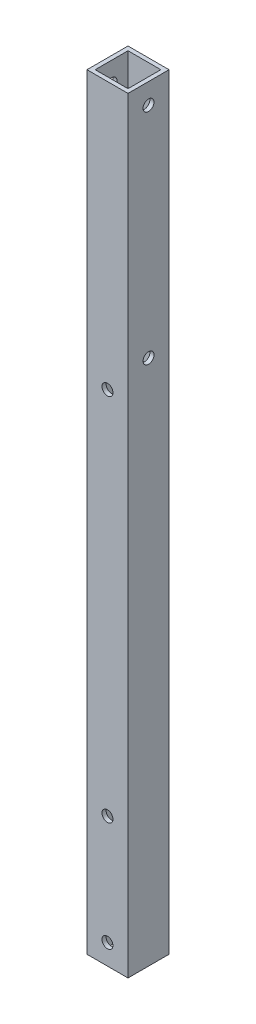
ISO-10303-21;
HEADER;
FILE_DESCRIPTION(('STEP AP214'),'2;1');
FILE_NAME('part.step','',(''),(''),'','','');
FILE_SCHEMA(('AUTOMOTIVE_DESIGN { 1 0 10303 214 1 1 1 1 }'));
ENDSEC;
DATA;
#1=APPLICATION_CONTEXT('core data for automotive mechanical design processes');
#2=APPLICATION_PROTOCOL_DEFINITION('international standard','automotive_design',2000,#1);
#3=PRODUCT_CONTEXT('',#1,'mechanical');
#4=PRODUCT('Part','Part','',(#3));
#5=PRODUCT_RELATED_PRODUCT_CATEGORY('part','',(#4));
#6=PRODUCT_DEFINITION_FORMATION('','',#4);
#7=PRODUCT_DEFINITION_CONTEXT('part definition',#1,'design');
#8=PRODUCT_DEFINITION('design','',#6,#7);
#9=PRODUCT_DEFINITION_SHAPE('','',#8);
#10=(LENGTH_UNIT() NAMED_UNIT(*) SI_UNIT(.MILLI.,.METRE.));
#11=(NAMED_UNIT(*) PLANE_ANGLE_UNIT() SI_UNIT($,.RADIAN.));
#12=(NAMED_UNIT(*) SI_UNIT($,.STERADIAN.) SOLID_ANGLE_UNIT());
#13=UNCERTAINTY_MEASURE_WITH_UNIT(LENGTH_MEASURE(1.E-05),#10,'distance_accuracy_value','');
#14=(GEOMETRIC_REPRESENTATION_CONTEXT(3) GLOBAL_UNCERTAINTY_ASSIGNED_CONTEXT((#13)) GLOBAL_UNIT_ASSIGNED_CONTEXT((#10,
#11,#12)) REPRESENTATION_CONTEXT('',''));
#15=CARTESIAN_POINT('',(0.,0.,0.));
#16=DIRECTION('',(0.,0.,1.));
#17=DIRECTION('',(1.,0.,0.));
#18=AXIS2_PLACEMENT_3D('',#15,#16,#17);
#19=CARTESIAN_POINT('',(0.,280.,0.));
#20=DIRECTION('',(0.,1.,0.));
#21=DIRECTION('',(0.,0.,1.));
#22=AXIS2_PLACEMENT_3D('',#19,#20,#21);
#23=PLANE('',#22);
#24=DIRECTION('',(0.,0.,-1.));
#25=VECTOR('',#24,1.);
#26=CARTESIAN_POINT('',(7.5,280.,7.5));
#27=LINE('',#26,#25);
#28=CARTESIAN_POINT('',(7.5,280.,7.5));
#29=VERTEX_POINT('',#28);
#30=CARTESIAN_POINT('',(7.5,280.,-7.5));
#31=VERTEX_POINT('',#30);
#32=EDGE_CURVE('E181',#29,#31,#27,.T.);
#33=ORIENTED_EDGE('',*,*,#32,.T.);
#34=DIRECTION('',(-1.,0.,0.));
#35=VECTOR('',#34,1.);
#36=CARTESIAN_POINT('',(-7.5,280.,-7.5));
#37=LINE('',#36,#35);
#38=CARTESIAN_POINT('',(-7.5,280.,-7.5));
#39=VERTEX_POINT('',#38);
#40=EDGE_CURVE('E185',#31,#39,#37,.T.);
#41=ORIENTED_EDGE('',*,*,#40,.T.);
#42=DIRECTION('',(0.,0.,1.));
#43=VECTOR('',#42,1.);
#44=CARTESIAN_POINT('',(-7.5,280.,7.5));
#45=LINE('',#44,#43);
#46=CARTESIAN_POINT('',(-7.5,280.,7.5));
#47=VERTEX_POINT('',#46);
#48=EDGE_CURVE('E189',#39,#47,#45,.T.);
#49=ORIENTED_EDGE('',*,*,#48,.T.);
#50=DIRECTION('',(1.,0.,0.));
#51=VECTOR('',#50,1.);
#52=CARTESIAN_POINT('',(-7.5,280.,7.5));
#53=LINE('',#52,#51);
#54=EDGE_CURVE('E192',#47,#29,#53,.T.);
#55=ORIENTED_EDGE('',*,*,#54,.T.);
#56=EDGE_LOOP('',(#33,#41,#49,#55));
#57=FACE_BOUND('',#56,.T.);
#58=DIRECTION('',(-1.,0.,0.));
#59=VECTOR('',#58,1.);
#60=CARTESIAN_POINT('',(0.,280.,-6.));
#61=LINE('',#60,#59);
#62=CARTESIAN_POINT('',(6.,280.,-6.));
#63=VERTEX_POINT('',#62);
#64=CARTESIAN_POINT('',(-6.,280.,-6.));
#65=VERTEX_POINT('',#64);
#66=EDGE_CURVE('E140',#63,#65,#61,.T.);
#67=ORIENTED_EDGE('',*,*,#66,.F.);
#68=DIRECTION('',(0.,0.,-1.));
#69=VECTOR('',#68,1.);
#70=CARTESIAN_POINT('',(6.,280.,0.));
#71=LINE('',#70,#69);
#72=CARTESIAN_POINT('',(6.,280.,6.));
#73=VERTEX_POINT('',#72);
#74=EDGE_CURVE('E131',#73,#63,#71,.T.);
#75=ORIENTED_EDGE('',*,*,#74,.F.);
#76=DIRECTION('',(1.,0.,0.));
#77=VECTOR('',#76,1.);
#78=CARTESIAN_POINT('',(0.,280.,6.));
#79=LINE('',#78,#77);
#80=CARTESIAN_POINT('',(-6.,280.,6.));
#81=VERTEX_POINT('',#80);
#82=EDGE_CURVE('E157',#81,#73,#79,.T.);
#83=ORIENTED_EDGE('',*,*,#82,.F.);
#84=DIRECTION('',(0.,0.,1.));
#85=VECTOR('',#84,1.);
#86=CARTESIAN_POINT('',(-6.,280.,0.));
#87=LINE('',#86,#85);
#88=EDGE_CURVE('E153',#65,#81,#87,.T.);
#89=ORIENTED_EDGE('',*,*,#88,.F.);
#90=EDGE_LOOP('',(#67,#75,#83,#89));
#91=FACE_BOUND('',#90,.T.);
#92=ADVANCED_FACE('F63',(#57,#91),#23,.T.);
#93=CARTESIAN_POINT('',(0.,0.,0.));
#94=DIRECTION('',(0.,1.,0.));
#95=DIRECTION('',(0.,0.,1.));
#96=AXIS2_PLACEMENT_3D('',#93,#94,#95);
#97=PLANE('',#96);
#98=DIRECTION('',(0.,0.,-1.));
#99=VECTOR('',#98,1.);
#100=CARTESIAN_POINT('',(7.5,0.,7.5));
#101=LINE('',#100,#99);
#102=CARTESIAN_POINT('',(7.5,0.,7.5));
#103=VERTEX_POINT('',#102);
#104=CARTESIAN_POINT('',(7.5,0.,-7.5));
#105=VERTEX_POINT('',#104);
#106=EDGE_CURVE('E149',#103,#105,#101,.T.);
#107=ORIENTED_EDGE('',*,*,#106,.F.);
#108=DIRECTION('',(1.,0.,0.));
#109=VECTOR('',#108,1.);
#110=CARTESIAN_POINT('',(-7.5,0.,7.5));
#111=LINE('',#110,#109);
#112=CARTESIAN_POINT('',(-7.5,0.,7.5));
#113=VERTEX_POINT('',#112);
#114=EDGE_CURVE('E186',#113,#103,#111,.T.);
#115=ORIENTED_EDGE('',*,*,#114,.F.);
#116=DIRECTION('',(0.,0.,1.));
#117=VECTOR('',#116,1.);
#118=CARTESIAN_POINT('',(-7.5,0.,7.5));
#119=LINE('',#118,#117);
#120=CARTESIAN_POINT('',(-7.5,0.,-7.5));
#121=VERTEX_POINT('',#120);
#122=EDGE_CURVE('E202',#121,#113,#119,.T.);
#123=ORIENTED_EDGE('',*,*,#122,.F.);
#124=DIRECTION('',(-1.,0.,0.));
#125=VECTOR('',#124,1.);
#126=CARTESIAN_POINT('',(-7.5,0.,-7.5));
#127=LINE('',#126,#125);
#128=EDGE_CURVE('E199',#105,#121,#127,.T.);
#129=ORIENTED_EDGE('',*,*,#128,.F.);
#130=EDGE_LOOP('',(#107,#115,#123,#129));
#131=FACE_BOUND('',#130,.T.);
#132=DIRECTION('',(0.,0.,-1.));
#133=VECTOR('',#132,1.);
#134=CARTESIAN_POINT('',(6.,0.,0.));
#135=LINE('',#134,#133);
#136=CARTESIAN_POINT('',(6.,0.,6.));
#137=VERTEX_POINT('',#136);
#138=CARTESIAN_POINT('',(6.,0.,-6.));
#139=VERTEX_POINT('',#138);
#140=EDGE_CURVE('E89',#137,#139,#135,.T.);
#141=ORIENTED_EDGE('',*,*,#140,.T.);
#142=DIRECTION('',(-1.,0.,0.));
#143=VECTOR('',#142,1.);
#144=CARTESIAN_POINT('',(0.,0.,-6.));
#145=LINE('',#144,#143);
#146=CARTESIAN_POINT('',(-6.,0.,-6.));
#147=VERTEX_POINT('',#146);
#148=EDGE_CURVE('E147',#139,#147,#145,.T.);
#149=ORIENTED_EDGE('',*,*,#148,.T.);
#150=DIRECTION('',(0.,0.,1.));
#151=VECTOR('',#150,1.);
#152=CARTESIAN_POINT('',(-6.,0.,0.));
#153=LINE('',#152,#151);
#154=CARTESIAN_POINT('',(-6.,0.,6.));
#155=VERTEX_POINT('',#154);
#156=EDGE_CURVE('E168',#147,#155,#153,.T.);
#157=ORIENTED_EDGE('',*,*,#156,.T.);
#158=DIRECTION('',(1.,0.,0.));
#159=VECTOR('',#158,1.);
#160=CARTESIAN_POINT('',(0.,0.,6.));
#161=LINE('',#160,#159);
#162=EDGE_CURVE('E141',#155,#137,#161,.T.);
#163=ORIENTED_EDGE('',*,*,#162,.T.);
#164=EDGE_LOOP('',(#141,#149,#157,#163));
#165=FACE_BOUND('',#164,.T.);
#166=ADVANCED_FACE('F295',(#131,#165),#97,.F.);
#167=CARTESIAN_POINT('',(7.5,280.,7.5));
#168=DIRECTION('',(-1.,0.,0.));
#169=DIRECTION('',(0.,0.,1.));
#170=AXIS2_PLACEMENT_3D('',#167,#168,#169);
#171=PLANE('',#170);
#172=CARTESIAN_POINT('',(7.5,272.5,0.));
#173=DIRECTION('',(1.,0.,0.));
#174=DIRECTION('',(0.,0.,-1.));
#175=AXIS2_PLACEMENT_3D('',#172,#173,#174);
#176=CIRCLE('',#175,2.);
#177=CARTESIAN_POINT('',(7.5,272.5,-2.));
#178=VERTEX_POINT('',#177);
#179=EDGE_CURVE('E258',#178,#178,#176,.T.);
#180=ORIENTED_EDGE('',*,*,#179,.F.);
#181=EDGE_LOOP('',(#180));
#182=FACE_BOUND('',#181,.T.);
#183=CARTESIAN_POINT('',(7.5,192.5,0.));
#184=DIRECTION('',(1.,0.,0.));
#185=DIRECTION('',(0.,0.,-1.));
#186=AXIS2_PLACEMENT_3D('',#183,#184,#185);
#187=CIRCLE('',#186,2.);
#188=CARTESIAN_POINT('',(7.5,192.5,-2.));
#189=VERTEX_POINT('',#188);
#190=EDGE_CURVE('E254',#189,#189,#187,.T.);
#191=ORIENTED_EDGE('',*,*,#190,.F.);
#192=EDGE_LOOP('',(#191));
#193=FACE_BOUND('',#192,.T.);
#194=ORIENTED_EDGE('',*,*,#106,.T.);
#195=DIRECTION('',(0.,-1.,0.));
#196=VECTOR('',#195,1.);
#197=CARTESIAN_POINT('',(7.5,280.,-7.5));
#198=LINE('',#197,#196);
#199=EDGE_CURVE('E12',#31,#105,#198,.T.);
#200=ORIENTED_EDGE('',*,*,#199,.F.);
#201=ORIENTED_EDGE('',*,*,#32,.F.);
#202=DIRECTION('',(0.,-1.,0.));
#203=VECTOR('',#202,1.);
#204=CARTESIAN_POINT('',(7.5,280.,7.5));
#205=LINE('',#204,#203);
#206=EDGE_CURVE('E195',#29,#103,#205,.T.);
#207=ORIENTED_EDGE('',*,*,#206,.T.);
#208=EDGE_LOOP('',(#194,#200,#201,#207));
#209=FACE_BOUND('',#208,.T.);
#210=ADVANCED_FACE('F65',(#182,#193,#209),#171,.F.);
#211=CARTESIAN_POINT('',(-7.5,280.,-7.5));
#212=DIRECTION('',(0.,0.,1.));
#213=DIRECTION('',(1.,0.,0.));
#214=AXIS2_PLACEMENT_3D('',#211,#212,#213);
#215=PLANE('',#214);
#216=CARTESIAN_POINT('',(0.,7.5,-7.5));
#217=DIRECTION('',(0.,0.,1.));
#218=DIRECTION('',(1.,0.,0.));
#219=AXIS2_PLACEMENT_3D('',#216,#217,#218);
#220=CIRCLE('',#219,2.);
#221=CARTESIAN_POINT('',(2.,7.5,-7.5));
#222=VERTEX_POINT('',#221);
#223=EDGE_CURVE('E231',#222,#222,#220,.T.);
#224=ORIENTED_EDGE('',*,*,#223,.T.);
#225=EDGE_LOOP('',(#224));
#226=FACE_BOUND('',#225,.T.);
#227=CARTESIAN_POINT('',(0.,47.5,-7.5));
#228=DIRECTION('',(0.,0.,1.));
#229=DIRECTION('',(1.,0.,0.));
#230=AXIS2_PLACEMENT_3D('',#227,#228,#229);
#231=CIRCLE('',#230,2.);
#232=CARTESIAN_POINT('',(2.,47.5,-7.5));
#233=VERTEX_POINT('',#232);
#234=EDGE_CURVE('E381',#233,#233,#231,.T.);
#235=ORIENTED_EDGE('',*,*,#234,.T.);
#236=EDGE_LOOP('',(#235));
#237=FACE_BOUND('',#236,.T.);
#238=CARTESIAN_POINT('',(0.,182.5,-7.5));
#239=DIRECTION('',(0.,0.,1.));
#240=DIRECTION('',(1.,0.,0.));
#241=AXIS2_PLACEMENT_3D('',#238,#239,#240);
#242=CIRCLE('',#241,2.);
#243=CARTESIAN_POINT('',(2.,182.5,-7.5));
#244=VERTEX_POINT('',#243);
#245=EDGE_CURVE('E390',#244,#244,#242,.T.);
#246=ORIENTED_EDGE('',*,*,#245,.T.);
#247=EDGE_LOOP('',(#246));
#248=FACE_BOUND('',#247,.T.);
#249=ORIENTED_EDGE('',*,*,#128,.T.);
#250=DIRECTION('',(0.,-1.,0.));
#251=VECTOR('',#250,1.);
#252=CARTESIAN_POINT('',(-7.5,280.,-7.5));
#253=LINE('',#252,#251);
#254=EDGE_CURVE('E73',#39,#121,#253,.T.);
#255=ORIENTED_EDGE('',*,*,#254,.F.);
#256=ORIENTED_EDGE('',*,*,#40,.F.);
#257=ORIENTED_EDGE('',*,*,#199,.T.);
#258=EDGE_LOOP('',(#249,#255,#256,#257));
#259=FACE_BOUND('',#258,.T.);
#260=ADVANCED_FACE('F294',(#226,#237,#248,#259),#215,.F.);
#261=CARTESIAN_POINT('',(-7.5,280.,7.5));
#262=DIRECTION('',(1.,0.,0.));
#263=DIRECTION('',(0.,0.,-1.));
#264=AXIS2_PLACEMENT_3D('',#261,#262,#263);
#265=PLANE('',#264);
#266=CARTESIAN_POINT('',(-7.5,272.5,0.));
#267=DIRECTION('',(1.,0.,0.));
#268=DIRECTION('',(0.,0.,-1.));
#269=AXIS2_PLACEMENT_3D('',#266,#267,#268);
#270=CIRCLE('',#269,2.);
#271=CARTESIAN_POINT('',(-7.5,272.5,-2.));
#272=VERTEX_POINT('',#271);
#273=EDGE_CURVE('E222',#272,#272,#270,.T.);
#274=ORIENTED_EDGE('',*,*,#273,.T.);
#275=EDGE_LOOP('',(#274));
#276=FACE_BOUND('',#275,.T.);
#277=CARTESIAN_POINT('',(-7.5,192.5,0.));
#278=DIRECTION('',(1.,0.,0.));
#279=DIRECTION('',(0.,0.,-1.));
#280=AXIS2_PLACEMENT_3D('',#277,#278,#279);
#281=CIRCLE('',#280,2.);
#282=CARTESIAN_POINT('',(-7.5,192.5,-2.));
#283=VERTEX_POINT('',#282);
#284=EDGE_CURVE('E262',#283,#283,#281,.T.);
#285=ORIENTED_EDGE('',*,*,#284,.T.);
#286=EDGE_LOOP('',(#285));
#287=FACE_BOUND('',#286,.T.);
#288=ORIENTED_EDGE('',*,*,#122,.T.);
#289=DIRECTION('',(0.,-1.,0.));
#290=VECTOR('',#289,1.);
#291=CARTESIAN_POINT('',(-7.5,280.,7.5));
#292=LINE('',#291,#290);
#293=EDGE_CURVE('E210',#47,#113,#292,.T.);
#294=ORIENTED_EDGE('',*,*,#293,.F.);
#295=ORIENTED_EDGE('',*,*,#48,.F.);
#296=ORIENTED_EDGE('',*,*,#254,.T.);
#297=EDGE_LOOP('',(#288,#294,#295,#296));
#298=FACE_BOUND('',#297,.T.);
#299=ADVANCED_FACE('F313',(#276,#287,#298),#265,.F.);
#300=CARTESIAN_POINT('',(-7.5,280.,7.5));
#301=DIRECTION('',(0.,0.,-1.));
#302=DIRECTION('',(-1.,0.,0.));
#303=AXIS2_PLACEMENT_3D('',#300,#301,#302);
#304=PLANE('',#303);
#305=CARTESIAN_POINT('',(0.,7.5,7.5));
#306=DIRECTION('',(0.,0.,1.));
#307=DIRECTION('',(1.,0.,0.));
#308=AXIS2_PLACEMENT_3D('',#305,#306,#307);
#309=CIRCLE('',#308,2.);
#310=CARTESIAN_POINT('',(2.,7.5,7.5));
#311=VERTEX_POINT('',#310);
#312=EDGE_CURVE('E377',#311,#311,#309,.T.);
#313=ORIENTED_EDGE('',*,*,#312,.F.);
#314=EDGE_LOOP('',(#313));
#315=FACE_BOUND('',#314,.T.);
#316=CARTESIAN_POINT('',(0.,47.5,7.5));
#317=DIRECTION('',(0.,0.,1.));
#318=DIRECTION('',(1.,0.,0.));
#319=AXIS2_PLACEMENT_3D('',#316,#317,#318);
#320=CIRCLE('',#319,2.);
#321=CARTESIAN_POINT('',(2.,47.5,7.5));
#322=VERTEX_POINT('',#321);
#323=EDGE_CURVE('E387',#322,#322,#320,.T.);
#324=ORIENTED_EDGE('',*,*,#323,.F.);
#325=EDGE_LOOP('',(#324));
#326=FACE_BOUND('',#325,.T.);
#327=CARTESIAN_POINT('',(0.,182.5,7.5));
#328=DIRECTION('',(0.,0.,1.));
#329=DIRECTION('',(1.,0.,0.));
#330=AXIS2_PLACEMENT_3D('',#327,#328,#329);
#331=CIRCLE('',#330,2.);
#332=CARTESIAN_POINT('',(2.,182.5,7.5));
#333=VERTEX_POINT('',#332);
#334=EDGE_CURVE('E247',#333,#333,#331,.T.);
#335=ORIENTED_EDGE('',*,*,#334,.F.);
#336=EDGE_LOOP('',(#335));
#337=FACE_BOUND('',#336,.T.);
#338=ORIENTED_EDGE('',*,*,#114,.T.);
#339=ORIENTED_EDGE('',*,*,#206,.F.);
#340=ORIENTED_EDGE('',*,*,#54,.F.);
#341=ORIENTED_EDGE('',*,*,#293,.T.);
#342=EDGE_LOOP('',(#338,#339,#340,#341));
#343=FACE_BOUND('',#342,.T.);
#344=ADVANCED_FACE('F280',(#315,#326,#337,#343),#304,.F.);
#345=CARTESIAN_POINT('',(6.,280.,0.));
#346=DIRECTION('',(-1.,0.,0.));
#347=DIRECTION('',(0.,0.,1.));
#348=AXIS2_PLACEMENT_3D('',#345,#346,#347);
#349=PLANE('',#348);
#350=CARTESIAN_POINT('',(6.,272.5,0.));
#351=DIRECTION('',(-1.,0.,0.));
#352=DIRECTION('',(0.,0.,1.));
#353=AXIS2_PLACEMENT_3D('',#350,#351,#352);
#354=CIRCLE('',#353,2.);
#355=CARTESIAN_POINT('',(6.,272.5,2.));
#356=VERTEX_POINT('',#355);
#357=EDGE_CURVE('E165',#356,#356,#354,.T.);
#358=ORIENTED_EDGE('',*,*,#357,.F.);
#359=EDGE_LOOP('',(#358));
#360=FACE_BOUND('',#359,.T.);
#361=CARTESIAN_POINT('',(6.,192.5,0.));
#362=DIRECTION('',(-1.,0.,0.));
#363=DIRECTION('',(0.,0.,1.));
#364=AXIS2_PLACEMENT_3D('',#361,#362,#363);
#365=CIRCLE('',#364,2.);
#366=CARTESIAN_POINT('',(6.,192.5,2.));
#367=VERTEX_POINT('',#366);
#368=EDGE_CURVE('E221',#367,#367,#365,.T.);
#369=ORIENTED_EDGE('',*,*,#368,.F.);
#370=EDGE_LOOP('',(#369));
#371=FACE_BOUND('',#370,.T.);
#372=ORIENTED_EDGE('',*,*,#140,.F.);
#373=DIRECTION('',(0.,-1.,0.));
#374=VECTOR('',#373,1.);
#375=CARTESIAN_POINT('',(6.,280.,6.));
#376=LINE('',#375,#374);
#377=EDGE_CURVE('E135',#73,#137,#376,.T.);
#378=ORIENTED_EDGE('',*,*,#377,.F.);
#379=ORIENTED_EDGE('',*,*,#74,.T.);
#380=DIRECTION('',(0.,-1.,0.));
#381=VECTOR('',#380,1.);
#382=CARTESIAN_POINT('',(6.,280.,-6.));
#383=LINE('',#382,#381);
#384=EDGE_CURVE('E134',#63,#139,#383,.T.);
#385=ORIENTED_EDGE('',*,*,#384,.T.);
#386=EDGE_LOOP('',(#372,#378,#379,#385));
#387=FACE_BOUND('',#386,.T.);
#388=ADVANCED_FACE('F133',(#360,#371,#387),#349,.T.);
#389=CARTESIAN_POINT('',(0.,280.,-6.));
#390=DIRECTION('',(0.,0.,1.));
#391=DIRECTION('',(1.,0.,0.));
#392=AXIS2_PLACEMENT_3D('',#389,#390,#391);
#393=PLANE('',#392);
#394=CARTESIAN_POINT('',(0.,7.5,-6.));
#395=DIRECTION('',(0.,0.,1.));
#396=DIRECTION('',(1.,0.,0.));
#397=AXIS2_PLACEMENT_3D('',#394,#395,#396);
#398=CIRCLE('',#397,2.);
#399=CARTESIAN_POINT('',(2.,7.5,-6.));
#400=VERTEX_POINT('',#399);
#401=EDGE_CURVE('E250',#400,#400,#398,.T.);
#402=ORIENTED_EDGE('',*,*,#401,.F.);
#403=EDGE_LOOP('',(#402));
#404=FACE_BOUND('',#403,.T.);
#405=CARTESIAN_POINT('',(0.,47.5,-6.));
#406=DIRECTION('',(0.,0.,1.));
#407=DIRECTION('',(1.,0.,0.));
#408=AXIS2_PLACEMENT_3D('',#405,#406,#407);
#409=CIRCLE('',#408,2.);
#410=CARTESIAN_POINT('',(2.,47.5,-6.));
#411=VERTEX_POINT('',#410);
#412=EDGE_CURVE('E235',#411,#411,#409,.T.);
#413=ORIENTED_EDGE('',*,*,#412,.F.);
#414=EDGE_LOOP('',(#413));
#415=FACE_BOUND('',#414,.T.);
#416=CARTESIAN_POINT('',(0.,182.5,-6.));
#417=DIRECTION('',(0.,0.,1.));
#418=DIRECTION('',(1.,0.,0.));
#419=AXIS2_PLACEMENT_3D('',#416,#417,#418);
#420=CIRCLE('',#419,2.);
#421=CARTESIAN_POINT('',(2.,182.5,-6.));
#422=VERTEX_POINT('',#421);
#423=EDGE_CURVE('E230',#422,#422,#420,.T.);
#424=ORIENTED_EDGE('',*,*,#423,.F.);
#425=EDGE_LOOP('',(#424));
#426=FACE_BOUND('',#425,.T.);
#427=ORIENTED_EDGE('',*,*,#148,.F.);
#428=ORIENTED_EDGE('',*,*,#384,.F.);
#429=ORIENTED_EDGE('',*,*,#66,.T.);
#430=DIRECTION('',(0.,-1.,0.));
#431=VECTOR('',#430,1.);
#432=CARTESIAN_POINT('',(-6.,280.,-6.));
#433=LINE('',#432,#431);
#434=EDGE_CURVE('E150',#65,#147,#433,.T.);
#435=ORIENTED_EDGE('',*,*,#434,.T.);
#436=EDGE_LOOP('',(#427,#428,#429,#435));
#437=FACE_BOUND('',#436,.T.);
#438=ADVANCED_FACE('F144',(#404,#415,#426,#437),#393,.T.);
#439=CARTESIAN_POINT('',(-6.,280.,0.));
#440=DIRECTION('',(1.,0.,0.));
#441=DIRECTION('',(0.,0.,-1.));
#442=AXIS2_PLACEMENT_3D('',#439,#440,#441);
#443=PLANE('',#442);
#444=CARTESIAN_POINT('',(-6.,272.5,0.));
#445=DIRECTION('',(1.,0.,0.));
#446=DIRECTION('',(0.,0.,-1.));
#447=AXIS2_PLACEMENT_3D('',#444,#445,#446);
#448=CIRCLE('',#447,2.);
#449=CARTESIAN_POINT('',(-6.,272.5,-2.));
#450=VERTEX_POINT('',#449);
#451=EDGE_CURVE('E223',#450,#450,#448,.T.);
#452=ORIENTED_EDGE('',*,*,#451,.F.);
#453=EDGE_LOOP('',(#452));
#454=FACE_BOUND('',#453,.T.);
#455=CARTESIAN_POINT('',(-6.,192.5,0.));
#456=DIRECTION('',(1.,0.,0.));
#457=DIRECTION('',(0.,0.,-1.));
#458=AXIS2_PLACEMENT_3D('',#455,#456,#457);
#459=CIRCLE('',#458,2.);
#460=CARTESIAN_POINT('',(-6.,192.5,-2.));
#461=VERTEX_POINT('',#460);
#462=EDGE_CURVE('E217',#461,#461,#459,.T.);
#463=ORIENTED_EDGE('',*,*,#462,.F.);
#464=EDGE_LOOP('',(#463));
#465=FACE_BOUND('',#464,.T.);
#466=ORIENTED_EDGE('',*,*,#156,.F.);
#467=ORIENTED_EDGE('',*,*,#434,.F.);
#468=ORIENTED_EDGE('',*,*,#88,.T.);
#469=DIRECTION('',(0.,-1.,0.));
#470=VECTOR('',#469,1.);
#471=CARTESIAN_POINT('',(-6.,280.,6.));
#472=LINE('',#471,#470);
#473=EDGE_CURVE('E81',#81,#155,#472,.T.);
#474=ORIENTED_EDGE('',*,*,#473,.T.);
#475=EDGE_LOOP('',(#466,#467,#468,#474));
#476=FACE_BOUND('',#475,.T.);
#477=ADVANCED_FACE('F334',(#454,#465,#476),#443,.T.);
#478=CARTESIAN_POINT('',(0.,280.,6.));
#479=DIRECTION('',(0.,0.,-1.));
#480=DIRECTION('',(-1.,0.,0.));
#481=AXIS2_PLACEMENT_3D('',#478,#479,#480);
#482=PLANE('',#481);
#483=CARTESIAN_POINT('',(0.,7.5,6.));
#484=DIRECTION('',(0.,0.,-1.));
#485=DIRECTION('',(-1.,0.,0.));
#486=AXIS2_PLACEMENT_3D('',#483,#484,#485);
#487=CIRCLE('',#486,2.);
#488=CARTESIAN_POINT('',(-2.,7.5,6.));
#489=VERTEX_POINT('',#488);
#490=EDGE_CURVE('E67',#489,#489,#487,.T.);
#491=ORIENTED_EDGE('',*,*,#490,.F.);
#492=EDGE_LOOP('',(#491));
#493=FACE_BOUND('',#492,.T.);
#494=CARTESIAN_POINT('',(0.,47.5,6.));
#495=DIRECTION('',(0.,0.,-1.));
#496=DIRECTION('',(-1.,0.,0.));
#497=AXIS2_PLACEMENT_3D('',#494,#495,#496);
#498=CIRCLE('',#497,2.);
#499=CARTESIAN_POINT('',(-2.,47.5,6.));
#500=VERTEX_POINT('',#499);
#501=EDGE_CURVE('E232',#500,#500,#498,.T.);
#502=ORIENTED_EDGE('',*,*,#501,.F.);
#503=EDGE_LOOP('',(#502));
#504=FACE_BOUND('',#503,.T.);
#505=CARTESIAN_POINT('',(0.,182.5,6.));
#506=DIRECTION('',(0.,0.,-1.));
#507=DIRECTION('',(-1.,0.,0.));
#508=AXIS2_PLACEMENT_3D('',#505,#506,#507);
#509=CIRCLE('',#508,2.);
#510=CARTESIAN_POINT('',(-2.,182.5,6.));
#511=VERTEX_POINT('',#510);
#512=EDGE_CURVE('E227',#511,#511,#509,.T.);
#513=ORIENTED_EDGE('',*,*,#512,.F.);
#514=EDGE_LOOP('',(#513));
#515=FACE_BOUND('',#514,.T.);
#516=ORIENTED_EDGE('',*,*,#162,.F.);
#517=ORIENTED_EDGE('',*,*,#473,.F.);
#518=ORIENTED_EDGE('',*,*,#82,.T.);
#519=ORIENTED_EDGE('',*,*,#377,.T.);
#520=EDGE_LOOP('',(#516,#517,#518,#519));
#521=FACE_BOUND('',#520,.T.);
#522=ADVANCED_FACE('F338',(#493,#504,#515,#521),#482,.T.);
#523=CARTESIAN_POINT('',(-7.5,192.5,0.));
#524=DIRECTION('',(1.,0.,0.));
#525=DIRECTION('',(0.,0.,-1.));
#526=AXIS2_PLACEMENT_3D('',#523,#524,#525);
#527=CYLINDRICAL_SURFACE('',#526,2.);
#528=ORIENTED_EDGE('',*,*,#462,.T.);
#529=EDGE_LOOP('',(#528));
#530=FACE_BOUND('',#529,.T.);
#531=ORIENTED_EDGE('',*,*,#284,.F.);
#532=EDGE_LOOP('',(#531));
#533=FACE_BOUND('',#532,.T.);
#534=ADVANCED_FACE('F289',(#530,#533),#527,.F.);
#535=CARTESIAN_POINT('',(-7.5,272.5,0.));
#536=DIRECTION('',(1.,0.,0.));
#537=DIRECTION('',(0.,0.,-1.));
#538=AXIS2_PLACEMENT_3D('',#535,#536,#537);
#539=CYLINDRICAL_SURFACE('',#538,2.);
#540=ORIENTED_EDGE('',*,*,#451,.T.);
#541=EDGE_LOOP('',(#540));
#542=FACE_BOUND('',#541,.T.);
#543=ORIENTED_EDGE('',*,*,#273,.F.);
#544=EDGE_LOOP('',(#543));
#545=FACE_BOUND('',#544,.T.);
#546=ADVANCED_FACE('F287',(#542,#545),#539,.F.);
#547=ORIENTED_EDGE('',*,*,#368,.T.);
#548=EDGE_LOOP('',(#547));
#549=FACE_BOUND('',#548,.T.);
#550=ORIENTED_EDGE('',*,*,#190,.T.);
#551=EDGE_LOOP('',(#550));
#552=FACE_BOUND('',#551,.T.);
#553=ADVANCED_FACE('F284',(#549,#552),#527,.F.);
#554=ORIENTED_EDGE('',*,*,#357,.T.);
#555=EDGE_LOOP('',(#554));
#556=FACE_BOUND('',#555,.T.);
#557=ORIENTED_EDGE('',*,*,#179,.T.);
#558=EDGE_LOOP('',(#557));
#559=FACE_BOUND('',#558,.T.);
#560=ADVANCED_FACE('F275',(#556,#559),#539,.F.);
#561=CARTESIAN_POINT('',(0.,182.5,-7.5));
#562=DIRECTION('',(0.,0.,1.));
#563=DIRECTION('',(1.,0.,0.));
#564=AXIS2_PLACEMENT_3D('',#561,#562,#563);
#565=CYLINDRICAL_SURFACE('',#564,2.);
#566=ORIENTED_EDGE('',*,*,#512,.T.);
#567=EDGE_LOOP('',(#566));
#568=FACE_BOUND('',#567,.T.);
#569=ORIENTED_EDGE('',*,*,#334,.T.);
#570=EDGE_LOOP('',(#569));
#571=FACE_BOUND('',#570,.T.);
#572=ADVANCED_FACE('F348',(#568,#571),#565,.F.);
#573=CARTESIAN_POINT('',(0.,47.5,-7.5));
#574=DIRECTION('',(0.,0.,1.));
#575=DIRECTION('',(1.,0.,0.));
#576=AXIS2_PLACEMENT_3D('',#573,#574,#575);
#577=CYLINDRICAL_SURFACE('',#576,2.);
#578=ORIENTED_EDGE('',*,*,#501,.T.);
#579=EDGE_LOOP('',(#578));
#580=FACE_BOUND('',#579,.T.);
#581=ORIENTED_EDGE('',*,*,#323,.T.);
#582=EDGE_LOOP('',(#581));
#583=FACE_BOUND('',#582,.T.);
#584=ADVANCED_FACE('F351',(#580,#583),#577,.F.);
#585=CARTESIAN_POINT('',(0.,7.5,-7.5));
#586=DIRECTION('',(0.,0.,1.));
#587=DIRECTION('',(1.,0.,0.));
#588=AXIS2_PLACEMENT_3D('',#585,#586,#587);
#589=CYLINDRICAL_SURFACE('',#588,2.);
#590=ORIENTED_EDGE('',*,*,#490,.T.);
#591=EDGE_LOOP('',(#590));
#592=FACE_BOUND('',#591,.T.);
#593=ORIENTED_EDGE('',*,*,#312,.T.);
#594=EDGE_LOOP('',(#593));
#595=FACE_BOUND('',#594,.T.);
#596=ADVANCED_FACE('F356',(#592,#595),#589,.F.);
#597=ORIENTED_EDGE('',*,*,#423,.T.);
#598=EDGE_LOOP('',(#597));
#599=FACE_BOUND('',#598,.T.);
#600=ORIENTED_EDGE('',*,*,#245,.F.);
#601=EDGE_LOOP('',(#600));
#602=FACE_BOUND('',#601,.T.);
#603=ADVANCED_FACE('F353',(#599,#602),#565,.F.);
#604=ORIENTED_EDGE('',*,*,#412,.T.);
#605=EDGE_LOOP('',(#604));
#606=FACE_BOUND('',#605,.T.);
#607=ORIENTED_EDGE('',*,*,#234,.F.);
#608=EDGE_LOOP('',(#607));
#609=FACE_BOUND('',#608,.T.);
#610=ADVANCED_FACE('F357',(#606,#609),#577,.F.);
#611=ORIENTED_EDGE('',*,*,#401,.T.);
#612=EDGE_LOOP('',(#611));
#613=FACE_BOUND('',#612,.T.);
#614=ORIENTED_EDGE('',*,*,#223,.F.);
#615=EDGE_LOOP('',(#614));
#616=FACE_BOUND('',#615,.T.);
#617=ADVANCED_FACE('F360',(#613,#616),#589,.F.);
#618=CLOSED_SHELL('',(#92,#166,#210,#260,#299,#344,#388,#438,#477,#522,#534,#546,#553,#560,#572,
#584,#596,#603,#610,#617));
#619=MANIFOLD_SOLID_BREP('B2',#618);
#620=ADVANCED_BREP_SHAPE_REPRESENTATION('',(#18,#619),#14);
#621=SHAPE_DEFINITION_REPRESENTATION(#9,#620);
ENDSEC;
END-ISO-10303-21;
